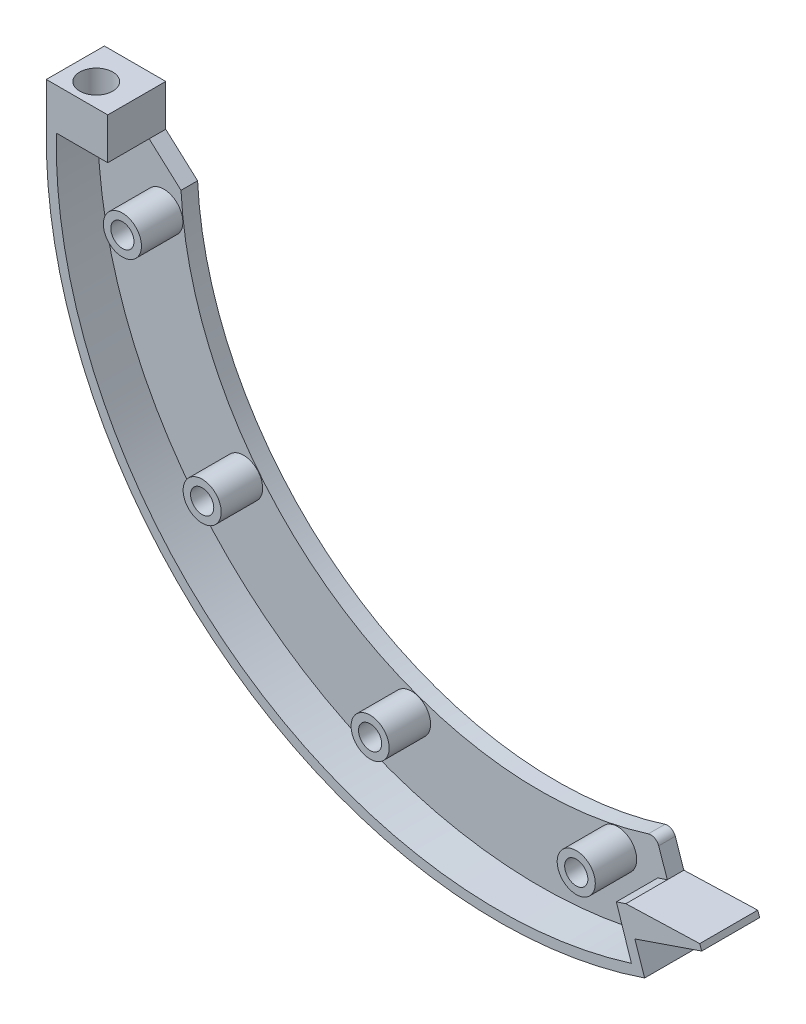
ISO-10303-21;
HEADER;
FILE_DESCRIPTION(('STEP AP214'),'2;1');
FILE_NAME('part.step','',(''),(''),'','','');
FILE_SCHEMA(('AUTOMOTIVE_DESIGN { 1 0 10303 214 1 1 1 1 }'));
ENDSEC;
DATA;
#1=APPLICATION_CONTEXT('core data for automotive mechanical design processes');
#2=APPLICATION_PROTOCOL_DEFINITION('international standard','automotive_design',2000,#1);
#3=PRODUCT_CONTEXT('',#1,'mechanical');
#4=PRODUCT('Part','Part','',(#3));
#5=PRODUCT_RELATED_PRODUCT_CATEGORY('part','',(#4));
#6=PRODUCT_DEFINITION_FORMATION('','',#4);
#7=PRODUCT_DEFINITION_CONTEXT('part definition',#1,'design');
#8=PRODUCT_DEFINITION('design','',#6,#7);
#9=PRODUCT_DEFINITION_SHAPE('','',#8);
#10=(LENGTH_UNIT() NAMED_UNIT(*) SI_UNIT(.MILLI.,.METRE.));
#11=(NAMED_UNIT(*) PLANE_ANGLE_UNIT() SI_UNIT($,.RADIAN.));
#12=(NAMED_UNIT(*) SI_UNIT($,.STERADIAN.) SOLID_ANGLE_UNIT());
#13=UNCERTAINTY_MEASURE_WITH_UNIT(LENGTH_MEASURE(1.E-05),#10,'distance_accuracy_value','');
#14=(GEOMETRIC_REPRESENTATION_CONTEXT(3) GLOBAL_UNCERTAINTY_ASSIGNED_CONTEXT((#13)) GLOBAL_UNIT_ASSIGNED_CONTEXT((#10,
#11,#12)) REPRESENTATION_CONTEXT('',''));
#15=CARTESIAN_POINT('',(0.,0.,0.));
#16=DIRECTION('',(0.,0.,1.));
#17=DIRECTION('',(1.,0.,0.));
#18=AXIS2_PLACEMENT_3D('',#15,#16,#17);
#19=CARTESIAN_POINT('',(14.6736792549798,-134.127250964701,2.));
#20=DIRECTION('',(-0.946107937554951,-0.323851463630345,0.));
#21=DIRECTION('',(0.323851463630345,-0.946107937554951,0.));
#22=AXIS2_PLACEMENT_3D('',#19,#20,#21);
#23=PLANE('',#22);
#24=DIRECTION('',(0.,0.,-1.));
#25=VECTOR('',#24,1.);
#26=CARTESIAN_POINT('',(14.6736792549798,-134.127250964701,2.));
#27=LINE('',#26,#25);
#28=CARTESIAN_POINT('',(14.6736792549798,-134.127250964701,7.));
#29=VERTEX_POINT('',#28);
#30=CARTESIAN_POINT('',(14.6736792549798,-134.127250964701,0.));
#31=VERTEX_POINT('',#30);
#32=EDGE_CURVE('E284',#29,#31,#27,.T.);
#33=ORIENTED_EDGE('',*,*,#32,.F.);
#34=DIRECTION('',(-0.323851463630344,0.946107937554951,0.));
#35=VECTOR('',#34,1.);
#36=CARTESIAN_POINT('',(15.8676694079897,-137.6154042942,7.));
#37=LINE('',#36,#35);
#38=CARTESIAN_POINT('',(15.8676694079897,-137.6154042942,7.));
#39=VERTEX_POINT('',#38);
#40=EDGE_CURVE('E226',#39,#29,#37,.T.);
#41=ORIENTED_EDGE('',*,*,#40,.F.);
#42=DIRECTION('',(0.,0.,-1.));
#43=VECTOR('',#42,1.);
#44=CARTESIAN_POINT('',(15.8676694079896,-137.6154042942,2.));
#45=LINE('',#44,#43);
#46=CARTESIAN_POINT('',(15.8676694079896,-137.6154042942,0.));
#47=VERTEX_POINT('',#46);
#48=EDGE_CURVE('E287',#39,#47,#45,.T.);
#49=ORIENTED_EDGE('',*,*,#48,.T.);
#50=DIRECTION('',(-0.323851463630345,0.946107937554951,0.));
#51=VECTOR('',#50,1.);
#52=CARTESIAN_POINT('',(14.6736792549798,-134.127250964701,0.));
#53=LINE('',#52,#51);
#54=EDGE_CURVE('E275',#47,#31,#53,.T.);
#55=ORIENTED_EDGE('',*,*,#54,.T.);
#56=EDGE_LOOP('',(#33,#41,#49,#55));
#57=FACE_BOUND('',#56,.T.);
#58=ADVANCED_FACE('F34',(#57),#23,.F.);
#59=CARTESIAN_POINT('',(13.5976751917569,-130.983785211468,2.));
#60=DIRECTION('',(0.0319240642782076,-0.999490297161489,0.));
#61=DIRECTION('',(0.999490297161489,0.0319240642782076,0.));
#62=AXIS2_PLACEMENT_3D('',#59,#60,#61);
#63=PLANE('',#62);
#64=DIRECTION('',(-0.999490297161489,-0.0319240642782076,0.));
#65=VECTOR('',#64,1.);
#66=CARTESIAN_POINT('',(13.5976751917569,-130.983785211468,0.));
#67=LINE('',#66,#65);
#68=CARTESIAN_POINT('',(22.5089113422996,-130.699157260125,0.));
#69=VERTEX_POINT('',#68);
#70=CARTESIAN_POINT('',(13.5976751917569,-130.983785211468,0.));
#71=VERTEX_POINT('',#70);
#72=EDGE_CURVE('E252',#69,#71,#67,.T.);
#73=ORIENTED_EDGE('',*,*,#72,.T.);
#74=DIRECTION('',(0.,0.,-1.));
#75=VECTOR('',#74,1.);
#76=CARTESIAN_POINT('',(13.5976751917569,-130.983785211468,2.));
#77=LINE('',#76,#75);
#78=CARTESIAN_POINT('',(13.5976751917569,-130.983785211468,2.));
#79=VERTEX_POINT('',#78);
#80=EDGE_CURVE('E11',#79,#71,#77,.T.);
#81=ORIENTED_EDGE('',*,*,#80,.F.);
#82=DIRECTION('',(0.,0.,-1.));
#83=VECTOR('',#82,1.);
#84=CARTESIAN_POINT('',(13.5976751917569,-130.983785211468,7.));
#85=LINE('',#84,#83);
#86=CARTESIAN_POINT('',(13.5976751917569,-130.983785211468,7.));
#87=VERTEX_POINT('',#86);
#88=EDGE_CURVE('E249',#87,#79,#85,.T.);
#89=ORIENTED_EDGE('',*,*,#88,.F.);
#90=DIRECTION('',(-0.999490297161489,-0.0319240642782076,0.));
#91=VECTOR('',#90,1.);
#92=CARTESIAN_POINT('',(22.5089113422996,-130.699157260125,7.));
#93=LINE('',#92,#91);
#94=CARTESIAN_POINT('',(22.5089113422996,-130.699157260125,7.));
#95=VERTEX_POINT('',#94);
#96=EDGE_CURVE('E196',#95,#87,#93,.T.);
#97=ORIENTED_EDGE('',*,*,#96,.F.);
#98=DIRECTION('',(0.,0.,-1.));
#99=VECTOR('',#98,1.);
#100=CARTESIAN_POINT('',(22.5089113422996,-130.699157260125,2.));
#101=LINE('',#100,#99);
#102=EDGE_CURVE('E261',#95,#69,#101,.T.);
#103=ORIENTED_EDGE('',*,*,#102,.T.);
#104=EDGE_LOOP('',(#73,#81,#89,#97,#103));
#105=FACE_BOUND('',#104,.T.);
#106=ADVANCED_FACE('F36',(#105),#63,.F.);
#107=CARTESIAN_POINT('',(12.560733381261,-127.954436921066,2.));
#108=DIRECTION('',(-0.94610793755495,-0.323851463630347,0.));
#109=DIRECTION('',(0.323851463630347,-0.94610793755495,0.));
#110=AXIS2_PLACEMENT_3D('',#107,#108,#109);
#111=PLANE('',#110);
#112=DIRECTION('',(-0.323851463630347,0.94610793755495,0.));
#113=VECTOR('',#112,1.);
#114=CARTESIAN_POINT('',(12.560733381261,-127.954436921066,0.));
#115=LINE('',#114,#113);
#116=CARTESIAN_POINT('',(12.560733381261,-127.954436921066,0.));
#117=VERTEX_POINT('',#116);
#118=EDGE_CURVE('E264',#71,#117,#115,.T.);
#119=ORIENTED_EDGE('',*,*,#118,.T.);
#120=DIRECTION('',(0.,0.,-1.));
#121=VECTOR('',#120,1.);
#122=CARTESIAN_POINT('',(12.560733381261,-127.954436921066,2.));
#123=LINE('',#122,#121);
#124=CARTESIAN_POINT('',(12.560733381261,-127.954436921066,2.));
#125=VERTEX_POINT('',#124);
#126=EDGE_CURVE('E43',#125,#117,#123,.T.);
#127=ORIENTED_EDGE('',*,*,#126,.F.);
#128=DIRECTION('',(-0.323851463630347,0.94610793755495,0.));
#129=VECTOR('',#128,1.);
#130=CARTESIAN_POINT('',(12.560733381261,-127.954436921066,2.));
#131=LINE('',#130,#129);
#132=EDGE_CURVE('E96',#79,#125,#131,.T.);
#133=ORIENTED_EDGE('',*,*,#132,.F.);
#134=ORIENTED_EDGE('',*,*,#80,.T.);
#135=EDGE_LOOP('',(#119,#127,#133,#134));
#136=FACE_BOUND('',#135,.T.);
#137=ADVANCED_FACE('F411',(#136),#111,.F.);
#138=CARTESIAN_POINT('',(11.614625443706,-128.278288384696,2.));
#139=DIRECTION('',(0.,0.,-1.));
#140=DIRECTION('',(-1.,0.,0.));
#141=AXIS2_PLACEMENT_3D('',#138,#139,#140);
#142=CYLINDRICAL_SURFACE('',#141,1.00000000000001);
#143=CARTESIAN_POINT('',(11.614625443706,-128.278288384696,0.));
#144=DIRECTION('',(0.,0.,1.));
#145=DIRECTION('',(1.,0.,0.));
#146=AXIS2_PLACEMENT_3D('',#143,#144,#145);
#147=CIRCLE('',#146,1.00000000000001);
#148=CARTESIAN_POINT('',(11.3121864035106,-127.32511965516,0.));
#149=VERTEX_POINT('',#148);
#150=EDGE_CURVE('E266',#117,#149,#147,.T.);
#151=ORIENTED_EDGE('',*,*,#150,.T.);
#152=DIRECTION('',(0.,0.,-1.));
#153=VECTOR('',#152,1.);
#154=CARTESIAN_POINT('',(11.3121864035106,-127.32511965516,2.));
#155=LINE('',#154,#153);
#156=CARTESIAN_POINT('',(11.3121864035106,-127.32511965516,2.));
#157=VERTEX_POINT('',#156);
#158=EDGE_CURVE('E298',#157,#149,#155,.T.);
#159=ORIENTED_EDGE('',*,*,#158,.F.);
#160=CARTESIAN_POINT('',(11.614625443706,-128.278288384696,2.));
#161=DIRECTION('',(0.,0.,1.));
#162=DIRECTION('',(1.,0.,0.));
#163=AXIS2_PLACEMENT_3D('',#160,#161,#162);
#164=CIRCLE('',#163,1.00000000000001);
#165=EDGE_CURVE('E254',#125,#157,#164,.T.);
#166=ORIENTED_EDGE('',*,*,#165,.F.);
#167=ORIENTED_EDGE('',*,*,#126,.T.);
#168=EDGE_LOOP('',(#151,#159,#166,#167));
#169=FACE_BOUND('',#168,.T.);
#170=ADVANCED_FACE('F305',(#169),#142,.T.);
#171=CARTESIAN_POINT('',(-1.8002134656574,-86.,2.));
#172=DIRECTION('',(0.,0.,-1.));
#173=DIRECTION('',(-1.,0.,0.));
#174=AXIS2_PLACEMENT_3D('',#171,#172,#173);
#175=CYLINDRICAL_SURFACE('',#174,43.3555134307302);
#176=CARTESIAN_POINT('',(-1.8002134656574,-86.,0.));
#177=DIRECTION('',(0.,0.,-1.));
#178=DIRECTION('',(1.,0.,0.));
#179=AXIS2_PLACEMENT_3D('',#176,#177,#178);
#180=CIRCLE('',#179,43.3555134307302);
#181=CARTESIAN_POINT('',(-45.0967686238364,-88.2602779202986,0.));
#182=VERTEX_POINT('',#181);
#183=EDGE_CURVE('E268',#149,#182,#180,.T.);
#184=ORIENTED_EDGE('',*,*,#183,.T.);
#185=DIRECTION('',(0.,0.,-1.));
#186=VECTOR('',#185,1.);
#187=CARTESIAN_POINT('',(-45.0967686238364,-88.2602779202986,2.));
#188=LINE('',#187,#186);
#189=CARTESIAN_POINT('',(-45.0967686238364,-88.2602779202986,2.));
#190=VERTEX_POINT('',#189);
#191=EDGE_CURVE('E295',#190,#182,#188,.T.);
#192=ORIENTED_EDGE('',*,*,#191,.F.);
#193=CARTESIAN_POINT('',(-1.8002134656574,-86.,2.));
#194=DIRECTION('',(0.,0.,-1.));
#195=DIRECTION('',(1.,0.,0.));
#196=AXIS2_PLACEMENT_3D('',#193,#194,#195);
#197=CIRCLE('',#196,43.3555134307302);
#198=EDGE_CURVE('E58',#157,#190,#197,.T.);
#199=ORIENTED_EDGE('',*,*,#198,.F.);
#200=ORIENTED_EDGE('',*,*,#158,.T.);
#201=EDGE_LOOP('',(#184,#192,#199,#200));
#202=FACE_BOUND('',#201,.T.);
#203=ADVANCED_FACE('F315',(#202),#175,.F.);
#204=CARTESIAN_POINT('',(-48.9404557954946,-84.8,2.));
#205=DIRECTION('',(-0.669067221918904,-0.743201892189276,0.));
#206=DIRECTION('',(0.743201892189276,-0.669067221918904,0.));
#207=AXIS2_PLACEMENT_3D('',#204,#205,#206);
#208=PLANE('',#207);
#209=DIRECTION('',(-0.743201892189276,0.669067221918904,0.));
#210=VECTOR('',#209,1.);
#211=CARTESIAN_POINT('',(-48.9404557954946,-84.8,0.));
#212=LINE('',#211,#210);
#213=CARTESIAN_POINT('',(-48.9404557954946,-84.8,0.));
#214=VERTEX_POINT('',#213);
#215=EDGE_CURVE('E270',#182,#214,#212,.T.);
#216=ORIENTED_EDGE('',*,*,#215,.T.);
#217=DIRECTION('',(0.,0.,-1.));
#218=VECTOR('',#217,1.);
#219=CARTESIAN_POINT('',(-48.9404557954946,-84.8,2.));
#220=LINE('',#219,#218);
#221=CARTESIAN_POINT('',(-48.9404557954946,-84.8,2.));
#222=VERTEX_POINT('',#221);
#223=EDGE_CURVE('E293',#222,#214,#220,.T.);
#224=ORIENTED_EDGE('',*,*,#223,.F.);
#225=DIRECTION('',(-0.743201892189276,0.669067221918904,0.));
#226=VECTOR('',#225,1.);
#227=CARTESIAN_POINT('',(-48.9404557954946,-84.8,2.));
#228=LINE('',#227,#226);
#229=EDGE_CURVE('E257',#190,#222,#228,.T.);
#230=ORIENTED_EDGE('',*,*,#229,.F.);
#231=ORIENTED_EDGE('',*,*,#191,.T.);
#232=EDGE_LOOP('',(#216,#224,#230,#231));
#233=FACE_BOUND('',#232,.T.);
#234=ADVANCED_FACE('F318',(#233),#208,.F.);
#235=CARTESIAN_POINT('',(-1.8002134656574,-86.,2.));
#236=DIRECTION('',(0.,0.,-1.));
#237=DIRECTION('',(-1.,0.,0.));
#238=AXIS2_PLACEMENT_3D('',#235,#236,#237);
#239=CYLINDRICAL_SURFACE('',#238,54.5555134307302);
#240=CARTESIAN_POINT('',(-1.8002134656574,-86.,0.));
#241=DIRECTION('',(0.,0.,1.));
#242=DIRECTION('',(1.,0.,0.));
#243=AXIS2_PLACEMENT_3D('',#240,#241,#242);
#244=CIRCLE('',#243,54.5555134307302);
#245=CARTESIAN_POINT('',(-56.342527733486,-84.8,0.));
#246=VERTEX_POINT('',#245);
#247=EDGE_CURVE('E273',#246,#47,#244,.T.);
#248=ORIENTED_EDGE('',*,*,#247,.T.);
#249=ORIENTED_EDGE('',*,*,#48,.F.);
#250=CARTESIAN_POINT('',(-1.8002134656574,-86.,7.));
#251=DIRECTION('',(0.,0.,1.));
#252=DIRECTION('',(1.,0.,0.));
#253=AXIS2_PLACEMENT_3D('',#250,#251,#252);
#254=CIRCLE('',#253,54.5555134307302);
#255=CARTESIAN_POINT('',(-56.342527733486,-84.8,7.));
#256=VERTEX_POINT('',#255);
#257=EDGE_CURVE('E224',#256,#39,#254,.T.);
#258=ORIENTED_EDGE('',*,*,#257,.F.);
#259=DIRECTION('',(0.,0.,-1.));
#260=VECTOR('',#259,1.);
#261=CARTESIAN_POINT('',(-56.342527733486,-84.8,2.));
#262=LINE('',#261,#260);
#263=EDGE_CURVE('E290',#256,#246,#262,.T.);
#264=ORIENTED_EDGE('',*,*,#263,.T.);
#265=EDGE_LOOP('',(#248,#249,#258,#264));
#266=FACE_BOUND('',#265,.T.);
#267=ADVANCED_FACE('F352',(#266),#239,.T.);
#268=CARTESIAN_POINT('',(16.8879105550717,-133.369322594283,2.));
#269=DIRECTION('',(-0.323851463630348,0.94610793755495,0.));
#270=DIRECTION('',(-0.94610793755495,-0.323851463630348,0.));
#271=AXIS2_PLACEMENT_3D('',#268,#269,#270);
#272=PLANE('',#271);
#273=DIRECTION('',(0.94610793755495,0.323851463630348,0.));
#274=VECTOR('',#273,1.);
#275=CARTESIAN_POINT('',(16.8879105550717,-133.369322594283,0.));
#276=LINE('',#275,#274);
#277=CARTESIAN_POINT('',(22.7494643441701,-131.362920683468,0.));
#278=VERTEX_POINT('',#277);
#279=EDGE_CURVE('E278',#31,#278,#276,.T.);
#280=ORIENTED_EDGE('',*,*,#279,.T.);
#281=DIRECTION('',(0.,0.,-1.));
#282=VECTOR('',#281,1.);
#283=CARTESIAN_POINT('',(22.7494643441701,-131.362920683468,2.));
#284=LINE('',#283,#282);
#285=CARTESIAN_POINT('',(22.7494643441701,-131.362920683468,7.));
#286=VERTEX_POINT('',#285);
#287=EDGE_CURVE('E282',#286,#278,#284,.T.);
#288=ORIENTED_EDGE('',*,*,#287,.F.);
#289=DIRECTION('',(0.94610793755495,0.323851463630347,0.));
#290=VECTOR('',#289,1.);
#291=CARTESIAN_POINT('',(14.6736792549798,-134.127250964701,7.));
#292=LINE('',#291,#290);
#293=EDGE_CURVE('E185',#29,#286,#292,.T.);
#294=ORIENTED_EDGE('',*,*,#293,.F.);
#295=ORIENTED_EDGE('',*,*,#32,.T.);
#296=EDGE_LOOP('',(#280,#288,#294,#295));
#297=FACE_BOUND('',#296,.T.);
#298=ADVANCED_FACE('F347',(#297),#272,.F.);
#299=CARTESIAN_POINT('',(22.5089113422996,-130.699157260125,2.));
#300=DIRECTION('',(-0.940163853307504,-0.340722656913194,0.));
#301=DIRECTION('',(0.340722656913194,-0.940163853307504,0.));
#302=AXIS2_PLACEMENT_3D('',#299,#300,#301);
#303=PLANE('',#302);
#304=DIRECTION('',(-0.340722656913194,0.940163853307504,0.));
#305=VECTOR('',#304,1.);
#306=CARTESIAN_POINT('',(22.5089113422996,-130.699157260125,0.));
#307=LINE('',#306,#305);
#308=EDGE_CURVE('E91',#278,#69,#307,.T.);
#309=ORIENTED_EDGE('',*,*,#308,.T.);
#310=ORIENTED_EDGE('',*,*,#102,.F.);
#311=DIRECTION('',(-0.340722656913194,0.940163853307504,0.));
#312=VECTOR('',#311,1.);
#313=CARTESIAN_POINT('',(22.7494643441701,-131.362920683468,7.));
#314=LINE('',#313,#312);
#315=EDGE_CURVE('E188',#286,#95,#314,.T.);
#316=ORIENTED_EDGE('',*,*,#315,.F.);
#317=ORIENTED_EDGE('',*,*,#287,.T.);
#318=EDGE_LOOP('',(#309,#310,#316,#317));
#319=FACE_BOUND('',#318,.T.);
#320=ADVANCED_FACE('F341',(#319),#303,.F.);
#321=CARTESIAN_POINT('',(-1.8002134656574,-86.,2.));
#322=DIRECTION('',(0.,0.,1.));
#323=DIRECTION('',(1.,0.,0.));
#324=AXIS2_PLACEMENT_3D('',#321,#322,#323);
#325=PLANE('',#324);
#326=CARTESIAN_POINT('',(-47.1727402853458,-91.4738290971626,2.));
#327=DIRECTION('',(0.,0.,1.));
#328=DIRECTION('',(1.,0.,0.));
#329=AXIS2_PLACEMENT_3D('',#326,#327,#328);
#330=CIRCLE('',#329,2.29999999999999);
#331=CARTESIAN_POINT('',(-44.8727402853458,-91.4738290971626,2.));
#332=VERTEX_POINT('',#331);
#333=EDGE_CURVE('E199',#332,#332,#330,.T.);
#334=ORIENTED_EDGE('',*,*,#333,.F.);
#335=EDGE_LOOP('',(#334));
#336=FACE_BOUND('',#335,.T.);
#337=CARTESIAN_POINT('',(-37.5438954317248,-114.478381177604,2.));
#338=DIRECTION('',(0.,0.,1.));
#339=DIRECTION('',(1.,0.,0.));
#340=AXIS2_PLACEMENT_3D('',#337,#338,#339);
#341=CIRCLE('',#340,2.30000000000001);
#342=CARTESIAN_POINT('',(-35.2438954317248,-114.478381177604,2.));
#343=VERTEX_POINT('',#342);
#344=EDGE_CURVE('E203',#343,#343,#341,.T.);
#345=ORIENTED_EDGE('',*,*,#344,.F.);
#346=EDGE_LOOP('',(#345));
#347=FACE_BOUND('',#346,.T.);
#348=CARTESIAN_POINT('',(-17.2717739571804,-129.003020951387,2.));
#349=DIRECTION('',(0.,0.,1.));
#350=DIRECTION('',(1.,0.,0.));
#351=AXIS2_PLACEMENT_3D('',#348,#349,#350);
#352=CIRCLE('',#351,2.3);
#353=CARTESIAN_POINT('',(-14.9717739571804,-129.003020951387,2.));
#354=VERTEX_POINT('',#353);
#355=EDGE_CURVE('E209',#354,#354,#352,.T.);
#356=ORIENTED_EDGE('',*,*,#355,.F.);
#357=EDGE_LOOP('',(#356));
#358=FACE_BOUND('',#357,.T.);
#359=CARTESIAN_POINT('',(7.60726233450451,-130.722795016162,2.));
#360=DIRECTION('',(0.,0.,1.));
#361=DIRECTION('',(1.,0.,0.));
#362=AXIS2_PLACEMENT_3D('',#359,#360,#361);
#363=CIRCLE('',#362,2.3);
#364=CARTESIAN_POINT('',(9.90726233450451,-130.722795016162,2.));
#365=VERTEX_POINT('',#364);
#366=EDGE_CURVE('E215',#365,#365,#363,.T.);
#367=ORIENTED_EDGE('',*,*,#366,.F.);
#368=EDGE_LOOP('',(#367));
#369=FACE_BOUND('',#368,.T.);
#370=CARTESIAN_POINT('',(-1.8002134656574,-86.,2.));
#371=DIRECTION('',(0.,0.,-1.));
#372=DIRECTION('',(-1.,0.,0.));
#373=AXIS2_PLACEMENT_3D('',#370,#371,#372);
#374=CIRCLE('',#373,53.3555134307302);
#375=CARTESIAN_POINT('',(14.2618263258736,-136.880464730504,2.));
#376=VERTEX_POINT('',#375);
#377=CARTESIAN_POINT('',(-55.1422308014953,-84.8,2.));
#378=VERTEX_POINT('',#377);
#379=EDGE_CURVE('E50',#376,#378,#374,.T.);
#380=ORIENTED_EDGE('',*,*,#379,.F.);
#381=DIRECTION('',(0.311856299867698,-0.950129279747145,0.));
#382=VECTOR('',#381,1.);
#383=CARTESIAN_POINT('',(14.2618263258736,-136.880464730504,2.));
#384=LINE('',#383,#382);
#385=CARTESIAN_POINT('',(12.4500261796725,-131.360472449809,2.));
#386=VERTEX_POINT('',#385);
#387=EDGE_CURVE('E239',#386,#376,#384,.T.);
#388=ORIENTED_EDGE('',*,*,#387,.F.);
#389=DIRECTION('',(-0.950129279747144,-0.311856299867699,0.));
#390=VECTOR('',#389,1.);
#391=CARTESIAN_POINT('',(13.5976751917569,-130.983785211468,2.));
#392=LINE('',#391,#390);
#393=EDGE_CURVE('E221',#79,#386,#392,.T.);
#394=ORIENTED_EDGE('',*,*,#393,.F.);
#395=ORIENTED_EDGE('',*,*,#132,.T.);
#396=ORIENTED_EDGE('',*,*,#165,.T.);
#397=ORIENTED_EDGE('',*,*,#198,.T.);
#398=ORIENTED_EDGE('',*,*,#229,.T.);
#399=DIRECTION('',(-1.,0.,0.));
#400=VECTOR('',#399,1.);
#401=CARTESIAN_POINT('',(-48.9404557954946,-84.8,2.));
#402=LINE('',#401,#400);
#403=EDGE_CURVE('E259',#222,#378,#402,.T.);
#404=ORIENTED_EDGE('',*,*,#403,.T.);
#405=EDGE_LOOP('',(#380,#388,#394,#395,#396,#397,#398,#404));
#406=FACE_BOUND('',#405,.T.);
#407=ADVANCED_FACE('F320',(#336,#347,#358,#369,#406),#325,.T.);
#408=CARTESIAN_POINT('',(-1.8002134656574,-86.,0.));
#409=DIRECTION('',(0.,0.,1.));
#410=DIRECTION('',(1.,0.,0.));
#411=AXIS2_PLACEMENT_3D('',#408,#409,#410);
#412=PLANE('',#411);
#413=ORIENTED_EDGE('',*,*,#72,.F.);
#414=ORIENTED_EDGE('',*,*,#308,.F.);
#415=ORIENTED_EDGE('',*,*,#279,.F.);
#416=ORIENTED_EDGE('',*,*,#54,.F.);
#417=ORIENTED_EDGE('',*,*,#247,.F.);
#418=DIRECTION('',(0.,-1.,0.));
#419=VECTOR('',#418,1.);
#420=CARTESIAN_POINT('',(-56.342527733486,-79.8,0.));
#421=LINE('',#420,#419);
#422=CARTESIAN_POINT('',(-56.342527733486,-79.8,0.));
#423=VERTEX_POINT('',#422);
#424=EDGE_CURVE('E353',#423,#246,#421,.T.);
#425=ORIENTED_EDGE('',*,*,#424,.F.);
#426=DIRECTION('',(-1.,0.,0.));
#427=VECTOR('',#426,1.);
#428=CARTESIAN_POINT('',(-56.342527733486,-79.8,0.));
#429=LINE('',#428,#427);
#430=CARTESIAN_POINT('',(-48.9404557954946,-79.8,0.));
#431=VERTEX_POINT('',#430);
#432=EDGE_CURVE('E177',#431,#423,#429,.T.);
#433=ORIENTED_EDGE('',*,*,#432,.F.);
#434=DIRECTION('',(0.,-1.,0.));
#435=VECTOR('',#434,1.);
#436=CARTESIAN_POINT('',(-48.9404557954946,-79.8,0.));
#437=LINE('',#436,#435);
#438=EDGE_CURVE('E190',#431,#214,#437,.T.);
#439=ORIENTED_EDGE('',*,*,#438,.T.);
#440=ORIENTED_EDGE('',*,*,#215,.F.);
#441=ORIENTED_EDGE('',*,*,#183,.F.);
#442=ORIENTED_EDGE('',*,*,#150,.F.);
#443=ORIENTED_EDGE('',*,*,#118,.F.);
#444=EDGE_LOOP('',(#413,#414,#415,#416,#417,#425,#433,#439,#440,#441,#442,#443));
#445=FACE_BOUND('',#444,.T.);
#446=ADVANCED_FACE('F311',(#445),#412,.F.);
#447=CARTESIAN_POINT('',(13.5976751917569,-130.983785211468,7.));
#448=DIRECTION('',(0.311856299867699,-0.950129279747144,0.));
#449=DIRECTION('',(0.950129279747145,0.311856299867699,0.));
#450=AXIS2_PLACEMENT_3D('',#447,#448,#449);
#451=PLANE('',#450);
#452=ORIENTED_EDGE('',*,*,#393,.T.);
#453=DIRECTION('',(0.,0.,-1.));
#454=VECTOR('',#453,1.);
#455=CARTESIAN_POINT('',(12.4500261796725,-131.360472449809,7.));
#456=LINE('',#455,#454);
#457=CARTESIAN_POINT('',(12.4500261796725,-131.360472449809,7.));
#458=VERTEX_POINT('',#457);
#459=EDGE_CURVE('E246',#458,#386,#456,.T.);
#460=ORIENTED_EDGE('',*,*,#459,.F.);
#461=DIRECTION('',(-0.950129279747144,-0.311856299867699,0.));
#462=VECTOR('',#461,1.);
#463=CARTESIAN_POINT('',(13.5976751917569,-130.983785211468,7.));
#464=LINE('',#463,#462);
#465=EDGE_CURVE('E229',#87,#458,#464,.T.);
#466=ORIENTED_EDGE('',*,*,#465,.F.);
#467=ORIENTED_EDGE('',*,*,#88,.T.);
#468=EDGE_LOOP('',(#452,#460,#466,#467));
#469=FACE_BOUND('',#468,.T.);
#470=ADVANCED_FACE('F334',(#469),#451,.F.);
#471=CARTESIAN_POINT('',(14.2618263258736,-136.880464730504,7.));
#472=DIRECTION('',(0.950129279747145,0.311856299867698,0.));
#473=DIRECTION('',(-0.311856299867698,0.950129279747145,0.));
#474=AXIS2_PLACEMENT_3D('',#471,#472,#473);
#475=PLANE('',#474);
#476=ORIENTED_EDGE('',*,*,#387,.T.);
#477=DIRECTION('',(0.,0.,-1.));
#478=VECTOR('',#477,1.);
#479=CARTESIAN_POINT('',(14.2618263258736,-136.880464730504,7.));
#480=LINE('',#479,#478);
#481=CARTESIAN_POINT('',(14.2618263258736,-136.880464730504,7.));
#482=VERTEX_POINT('',#481);
#483=EDGE_CURVE('E243',#482,#376,#480,.T.);
#484=ORIENTED_EDGE('',*,*,#483,.F.);
#485=DIRECTION('',(0.311856299867698,-0.950129279747145,0.));
#486=VECTOR('',#485,1.);
#487=CARTESIAN_POINT('',(14.2618263258736,-136.880464730504,7.));
#488=LINE('',#487,#486);
#489=EDGE_CURVE('E231',#458,#482,#488,.T.);
#490=ORIENTED_EDGE('',*,*,#489,.F.);
#491=ORIENTED_EDGE('',*,*,#459,.T.);
#492=EDGE_LOOP('',(#476,#484,#490,#491));
#493=FACE_BOUND('',#492,.T.);
#494=ADVANCED_FACE('F331',(#493),#475,.F.);
#495=CARTESIAN_POINT('',(-1.8002134656574,-86.,7.));
#496=DIRECTION('',(0.,0.,-1.));
#497=DIRECTION('',(-1.,0.,0.));
#498=AXIS2_PLACEMENT_3D('',#495,#496,#497);
#499=CYLINDRICAL_SURFACE('',#498,53.3555134307302);
#500=ORIENTED_EDGE('',*,*,#379,.T.);
#501=DIRECTION('',(0.,0.,-1.));
#502=VECTOR('',#501,1.);
#503=CARTESIAN_POINT('',(-55.1422308014953,-84.8,7.));
#504=LINE('',#503,#502);
#505=CARTESIAN_POINT('',(-55.1422308014953,-84.8,7.));
#506=VERTEX_POINT('',#505);
#507=EDGE_CURVE('E236',#506,#378,#504,.T.);
#508=ORIENTED_EDGE('',*,*,#507,.F.);
#509=CARTESIAN_POINT('',(-1.8002134656574,-86.,7.));
#510=DIRECTION('',(0.,0.,-1.));
#511=DIRECTION('',(1.,0.,0.));
#512=AXIS2_PLACEMENT_3D('',#509,#510,#511);
#513=CIRCLE('',#512,53.3555134307302);
#514=EDGE_CURVE('E233',#482,#506,#513,.T.);
#515=ORIENTED_EDGE('',*,*,#514,.F.);
#516=ORIENTED_EDGE('',*,*,#483,.T.);
#517=EDGE_LOOP('',(#500,#508,#515,#516));
#518=FACE_BOUND('',#517,.T.);
#519=ADVANCED_FACE('F326',(#518),#499,.F.);
#520=CARTESIAN_POINT('',(-1.8002134656574,-86.,7.));
#521=DIRECTION('',(0.,0.,1.));
#522=DIRECTION('',(1.,0.,0.));
#523=AXIS2_PLACEMENT_3D('',#520,#521,#522);
#524=PLANE('',#523);
#525=ORIENTED_EDGE('',*,*,#257,.T.);
#526=ORIENTED_EDGE('',*,*,#40,.T.);
#527=ORIENTED_EDGE('',*,*,#293,.T.);
#528=ORIENTED_EDGE('',*,*,#315,.T.);
#529=ORIENTED_EDGE('',*,*,#96,.T.);
#530=ORIENTED_EDGE('',*,*,#465,.T.);
#531=ORIENTED_EDGE('',*,*,#489,.T.);
#532=ORIENTED_EDGE('',*,*,#514,.T.);
#533=DIRECTION('',(1.,0.,0.));
#534=VECTOR('',#533,1.);
#535=CARTESIAN_POINT('',(-56.3557268963876,-84.8,7.));
#536=LINE('',#535,#534);
#537=CARTESIAN_POINT('',(-48.9404557954946,-84.8,7.));
#538=VERTEX_POINT('',#537);
#539=EDGE_CURVE('E359',#506,#538,#536,.T.);
#540=ORIENTED_EDGE('',*,*,#539,.T.);
#541=DIRECTION('',(0.,-1.,0.));
#542=VECTOR('',#541,1.);
#543=CARTESIAN_POINT('',(-48.9404557954946,-79.8,7.));
#544=LINE('',#543,#542);
#545=CARTESIAN_POINT('',(-48.9404557954946,-79.8,7.));
#546=VERTEX_POINT('',#545);
#547=EDGE_CURVE('E168',#546,#538,#544,.T.);
#548=ORIENTED_EDGE('',*,*,#547,.F.);
#549=DIRECTION('',(1.,0.,0.));
#550=VECTOR('',#549,1.);
#551=CARTESIAN_POINT('',(-56.3557268963876,-79.8,7.));
#552=LINE('',#551,#550);
#553=CARTESIAN_POINT('',(-56.3557268963876,-79.8,7.));
#554=VERTEX_POINT('',#553);
#555=EDGE_CURVE('E160',#554,#546,#552,.T.);
#556=ORIENTED_EDGE('',*,*,#555,.F.);
#557=DIRECTION('',(0.,-1.,0.));
#558=VECTOR('',#557,1.);
#559=CARTESIAN_POINT('',(-56.3557268963876,-79.8,7.));
#560=LINE('',#559,#558);
#561=CARTESIAN_POINT('',(-56.3557268963876,-84.8,7.));
#562=VERTEX_POINT('',#561);
#563=EDGE_CURVE('E165',#554,#562,#560,.T.);
#564=ORIENTED_EDGE('',*,*,#563,.T.);
#565=EDGE_CURVE('E349',#562,#256,#536,.T.);
#566=ORIENTED_EDGE('',*,*,#565,.T.);
#567=EDGE_LOOP('',(#525,#526,#527,#528,#529,#530,#531,#532,#540,#548,#556,#564,#566));
#568=FACE_BOUND('',#567,.T.);
#569=ADVANCED_FACE('F163',(#568),#524,.T.);
#570=CARTESIAN_POINT('',(7.60726233450451,-130.722795016162,7.));
#571=DIRECTION('',(0.,0.,-1.));
#572=DIRECTION('',(-1.,0.,0.));
#573=AXIS2_PLACEMENT_3D('',#570,#571,#572);
#574=CYLINDRICAL_SURFACE('',#573,2.3);
#575=CARTESIAN_POINT('',(7.60726233450451,-130.722795016162,7.));
#576=DIRECTION('',(0.,0.,1.));
#577=DIRECTION('',(1.,0.,0.));
#578=AXIS2_PLACEMENT_3D('',#575,#576,#577);
#579=CIRCLE('',#578,2.3);
#580=CARTESIAN_POINT('',(9.90726233450451,-130.722795016162,7.));
#581=VERTEX_POINT('',#580);
#582=EDGE_CURVE('E218',#581,#581,#579,.T.);
#583=ORIENTED_EDGE('',*,*,#582,.F.);
#584=EDGE_LOOP('',(#583));
#585=FACE_BOUND('',#584,.T.);
#586=ORIENTED_EDGE('',*,*,#366,.T.);
#587=EDGE_LOOP('',(#586));
#588=FACE_BOUND('',#587,.T.);
#589=ADVANCED_FACE('F492',(#585,#588),#574,.T.);
#590=CARTESIAN_POINT('',(7.60726233450451,-130.722795016162,7.));
#591=DIRECTION('',(0.,0.,1.));
#592=DIRECTION('',(1.,0.,0.));
#593=AXIS2_PLACEMENT_3D('',#590,#591,#592);
#594=PLANE('',#593);
#595=CARTESIAN_POINT('',(7.60726233450451,-130.722795016162,7.));
#596=DIRECTION('',(0.,0.,1.));
#597=DIRECTION('',(1.,0.,0.));
#598=AXIS2_PLACEMENT_3D('',#595,#596,#597);
#599=CIRCLE('',#598,1.4);
#600=CARTESIAN_POINT('',(9.00726233450451,-130.722795016162,7.));
#601=VERTEX_POINT('',#600);
#602=EDGE_CURVE('E363',#601,#601,#599,.T.);
#603=ORIENTED_EDGE('',*,*,#602,.F.);
#604=EDGE_LOOP('',(#603));
#605=FACE_BOUND('',#604,.T.);
#606=ORIENTED_EDGE('',*,*,#582,.T.);
#607=EDGE_LOOP('',(#606));
#608=FACE_BOUND('',#607,.T.);
#609=ADVANCED_FACE('F499',(#605,#608),#594,.T.);
#610=CARTESIAN_POINT('',(-17.2717739571804,-129.003020951387,7.));
#611=DIRECTION('',(0.,0.,-1.));
#612=DIRECTION('',(-1.,0.,0.));
#613=AXIS2_PLACEMENT_3D('',#610,#611,#612);
#614=CYLINDRICAL_SURFACE('',#613,2.3);
#615=CARTESIAN_POINT('',(-17.2717739571804,-129.003020951387,7.));
#616=DIRECTION('',(0.,0.,1.));
#617=DIRECTION('',(1.,0.,0.));
#618=AXIS2_PLACEMENT_3D('',#615,#616,#617);
#619=CIRCLE('',#618,2.3);
#620=CARTESIAN_POINT('',(-14.9717739571804,-129.003020951387,7.));
#621=VERTEX_POINT('',#620);
#622=EDGE_CURVE('E212',#621,#621,#619,.T.);
#623=ORIENTED_EDGE('',*,*,#622,.F.);
#624=EDGE_LOOP('',(#623));
#625=FACE_BOUND('',#624,.T.);
#626=ORIENTED_EDGE('',*,*,#355,.T.);
#627=EDGE_LOOP('',(#626));
#628=FACE_BOUND('',#627,.T.);
#629=ADVANCED_FACE('F508',(#625,#628),#614,.T.);
#630=CARTESIAN_POINT('',(-17.2717739571804,-129.003020951387,7.));
#631=DIRECTION('',(0.,0.,1.));
#632=DIRECTION('',(1.,0.,0.));
#633=AXIS2_PLACEMENT_3D('',#630,#631,#632);
#634=PLANE('',#633);
#635=CARTESIAN_POINT('',(-17.2717739571804,-129.003020951387,7.));
#636=DIRECTION('',(0.,0.,1.));
#637=DIRECTION('',(1.,0.,0.));
#638=AXIS2_PLACEMENT_3D('',#635,#636,#637);
#639=CIRCLE('',#638,1.4);
#640=CARTESIAN_POINT('',(-15.8717739571804,-129.003020951387,7.));
#641=VERTEX_POINT('',#640);
#642=EDGE_CURVE('E369',#641,#641,#639,.T.);
#643=ORIENTED_EDGE('',*,*,#642,.F.);
#644=EDGE_LOOP('',(#643));
#645=FACE_BOUND('',#644,.T.);
#646=ORIENTED_EDGE('',*,*,#622,.T.);
#647=EDGE_LOOP('',(#646));
#648=FACE_BOUND('',#647,.T.);
#649=ADVANCED_FACE('F517',(#645,#648),#634,.T.);
#650=CARTESIAN_POINT('',(-37.5438954317248,-114.478381177604,7.));
#651=DIRECTION('',(0.,0.,-1.));
#652=DIRECTION('',(-1.,0.,0.));
#653=AXIS2_PLACEMENT_3D('',#650,#651,#652);
#654=CYLINDRICAL_SURFACE('',#653,2.30000000000001);
#655=CARTESIAN_POINT('',(-37.5438954317248,-114.478381177604,7.));
#656=DIRECTION('',(0.,0.,1.));
#657=DIRECTION('',(1.,0.,0.));
#658=AXIS2_PLACEMENT_3D('',#655,#656,#657);
#659=CIRCLE('',#658,2.30000000000001);
#660=CARTESIAN_POINT('',(-35.2438954317248,-114.478381177604,7.));
#661=VERTEX_POINT('',#660);
#662=EDGE_CURVE('E206',#661,#661,#659,.T.);
#663=ORIENTED_EDGE('',*,*,#662,.F.);
#664=EDGE_LOOP('',(#663));
#665=FACE_BOUND('',#664,.T.);
#666=ORIENTED_EDGE('',*,*,#344,.T.);
#667=EDGE_LOOP('',(#666));
#668=FACE_BOUND('',#667,.T.);
#669=ADVANCED_FACE('F525',(#665,#668),#654,.T.);
#670=CARTESIAN_POINT('',(-37.5438954317248,-114.478381177604,7.));
#671=DIRECTION('',(0.,0.,1.));
#672=DIRECTION('',(1.,0.,0.));
#673=AXIS2_PLACEMENT_3D('',#670,#671,#672);
#674=PLANE('',#673);
#675=CARTESIAN_POINT('',(-37.5438954317248,-114.478381177604,7.));
#676=DIRECTION('',(0.,0.,1.));
#677=DIRECTION('',(1.,0.,0.));
#678=AXIS2_PLACEMENT_3D('',#675,#676,#677);
#679=CIRCLE('',#678,1.4);
#680=CARTESIAN_POINT('',(-36.1438954317248,-114.478381177604,7.));
#681=VERTEX_POINT('',#680);
#682=EDGE_CURVE('E375',#681,#681,#679,.T.);
#683=ORIENTED_EDGE('',*,*,#682,.F.);
#684=EDGE_LOOP('',(#683));
#685=FACE_BOUND('',#684,.T.);
#686=ORIENTED_EDGE('',*,*,#662,.T.);
#687=EDGE_LOOP('',(#686));
#688=FACE_BOUND('',#687,.T.);
#689=ADVANCED_FACE('F533',(#685,#688),#674,.T.);
#690=CARTESIAN_POINT('',(-47.1727402853458,-91.4738290971626,7.));
#691=DIRECTION('',(0.,0.,-1.));
#692=DIRECTION('',(-1.,0.,0.));
#693=AXIS2_PLACEMENT_3D('',#690,#691,#692);
#694=CYLINDRICAL_SURFACE('',#693,2.29999999999999);
#695=CARTESIAN_POINT('',(-47.1727402853458,-91.4738290971626,7.));
#696=DIRECTION('',(0.,0.,1.));
#697=DIRECTION('',(1.,0.,0.));
#698=AXIS2_PLACEMENT_3D('',#695,#696,#697);
#699=CIRCLE('',#698,2.29999999999999);
#700=CARTESIAN_POINT('',(-44.8727402853458,-91.4738290971626,7.));
#701=VERTEX_POINT('',#700);
#702=EDGE_CURVE('E200',#701,#701,#699,.T.);
#703=ORIENTED_EDGE('',*,*,#702,.F.);
#704=EDGE_LOOP('',(#703));
#705=FACE_BOUND('',#704,.T.);
#706=ORIENTED_EDGE('',*,*,#333,.T.);
#707=EDGE_LOOP('',(#706));
#708=FACE_BOUND('',#707,.T.);
#709=ADVANCED_FACE('F540',(#705,#708),#694,.T.);
#710=CARTESIAN_POINT('',(-47.1727402853458,-91.4738290971626,7.));
#711=DIRECTION('',(0.,0.,1.));
#712=DIRECTION('',(1.,0.,0.));
#713=AXIS2_PLACEMENT_3D('',#710,#711,#712);
#714=PLANE('',#713);
#715=CARTESIAN_POINT('',(-47.1727402853458,-91.4738290971626,7.));
#716=DIRECTION('',(0.,0.,1.));
#717=DIRECTION('',(1.,0.,0.));
#718=AXIS2_PLACEMENT_3D('',#715,#716,#717);
#719=CIRCLE('',#718,1.4);
#720=CARTESIAN_POINT('',(-45.7727402853458,-91.4738290971626,7.));
#721=VERTEX_POINT('',#720);
#722=EDGE_CURVE('E381',#721,#721,#719,.T.);
#723=ORIENTED_EDGE('',*,*,#722,.F.);
#724=EDGE_LOOP('',(#723));
#725=FACE_BOUND('',#724,.T.);
#726=ORIENTED_EDGE('',*,*,#702,.T.);
#727=EDGE_LOOP('',(#726));
#728=FACE_BOUND('',#727,.T.);
#729=ADVANCED_FACE('F548',(#725,#728),#714,.T.);
#730=CARTESIAN_POINT('',(0.,-84.8,0.));
#731=DIRECTION('',(0.,1.,0.));
#732=DIRECTION('',(0.,0.,1.));
#733=AXIS2_PLACEMENT_3D('',#730,#731,#732);
#734=PLANE('',#733);
#735=DIRECTION('',(-0.00188559134814937,0.,0.999998222271054));
#736=VECTOR('',#735,1.);
#737=CARTESIAN_POINT('',(-56.342527733486,-84.8,0.));
#738=LINE('',#737,#736);
#739=EDGE_CURVE('E184',#246,#562,#738,.T.);
#740=ORIENTED_EDGE('',*,*,#739,.F.);
#741=ORIENTED_EDGE('',*,*,#263,.F.);
#742=ORIENTED_EDGE('',*,*,#565,.F.);
#743=EDGE_LOOP('',(#740,#741,#742));
#744=FACE_BOUND('',#743,.T.);
#745=ADVANCED_FACE('F555',(#744),#734,.F.);
#746=CARTESIAN_POINT('',(-56.342527733486,-79.8,0.));
#747=DIRECTION('',(0.999998222271054,0.,0.00188559134814937));
#748=DIRECTION('',(0.00188559134814937,0.,-0.999998222271054));
#749=AXIS2_PLACEMENT_3D('',#746,#747,#748);
#750=PLANE('',#749);
#751=ORIENTED_EDGE('',*,*,#739,.T.);
#752=ORIENTED_EDGE('',*,*,#563,.F.);
#753=DIRECTION('',(-0.00188559134814937,0.,0.999998222271054));
#754=VECTOR('',#753,1.);
#755=CARTESIAN_POINT('',(-56.342527733486,-79.8,0.));
#756=LINE('',#755,#754);
#757=EDGE_CURVE('E172',#423,#554,#756,.T.);
#758=ORIENTED_EDGE('',*,*,#757,.F.);
#759=ORIENTED_EDGE('',*,*,#424,.T.);
#760=EDGE_LOOP('',(#751,#752,#758,#759));
#761=FACE_BOUND('',#760,.T.);
#762=ADVANCED_FACE('F182',(#761),#750,.F.);
#763=CARTESIAN_POINT('',(-48.9404557954946,-79.8,0.));
#764=DIRECTION('',(-1.,0.,0.));
#765=DIRECTION('',(0.,0.,1.));
#766=AXIS2_PLACEMENT_3D('',#763,#764,#765);
#767=PLANE('',#766);
#768=DIRECTION('',(0.,0.,-1.));
#769=VECTOR('',#768,1.);
#770=CARTESIAN_POINT('',(-48.9404557954946,-84.8,0.));
#771=LINE('',#770,#769);
#772=EDGE_CURVE('E180',#538,#222,#771,.T.);
#773=ORIENTED_EDGE('',*,*,#772,.T.);
#774=ORIENTED_EDGE('',*,*,#223,.T.);
#775=ORIENTED_EDGE('',*,*,#438,.F.);
#776=DIRECTION('',(0.,0.,-1.));
#777=VECTOR('',#776,1.);
#778=CARTESIAN_POINT('',(-48.9404557954946,-79.8,0.));
#779=LINE('',#778,#777);
#780=EDGE_CURVE('E171',#546,#431,#779,.T.);
#781=ORIENTED_EDGE('',*,*,#780,.F.);
#782=ORIENTED_EDGE('',*,*,#547,.T.);
#783=EDGE_LOOP('',(#773,#774,#775,#781,#782));
#784=FACE_BOUND('',#783,.T.);
#785=ADVANCED_FACE('F570',(#784),#767,.F.);
#786=CARTESIAN_POINT('',(0.,-79.8,0.));
#787=DIRECTION('',(0.,1.,0.));
#788=DIRECTION('',(0.,0.,1.));
#789=AXIS2_PLACEMENT_3D('',#786,#787,#788);
#790=PLANE('',#789);
#791=CARTESIAN_POINT('',(-53.1132786021442,-79.8,4.21275081708585));
#792=DIRECTION('',(0.,1.,0.));
#793=DIRECTION('',(0.,0.,1.));
#794=AXIS2_PLACEMENT_3D('',#791,#792,#793);
#795=CIRCLE('',#794,2.);
#796=CARTESIAN_POINT('',(-53.1132786021442,-79.8,6.21275081708585));
#797=VERTEX_POINT('',#796);
#798=EDGE_CURVE('E386',#797,#797,#795,.T.);
#799=ORIENTED_EDGE('',*,*,#798,.F.);
#800=EDGE_LOOP('',(#799));
#801=FACE_BOUND('',#800,.T.);
#802=ORIENTED_EDGE('',*,*,#757,.T.);
#803=ORIENTED_EDGE('',*,*,#555,.T.);
#804=ORIENTED_EDGE('',*,*,#780,.T.);
#805=ORIENTED_EDGE('',*,*,#432,.T.);
#806=EDGE_LOOP('',(#802,#803,#804,#805));
#807=FACE_BOUND('',#806,.T.);
#808=ADVANCED_FACE('F175',(#801,#807),#790,.T.);
#809=CARTESIAN_POINT('',(-53.1132786021442,-84.8,4.21275081708585));
#810=DIRECTION('',(0.,1.,0.));
#811=DIRECTION('',(0.,0.,1.));
#812=AXIS2_PLACEMENT_3D('',#809,#810,#811);
#813=CIRCLE('',#812,2.);
#814=CARTESIAN_POINT('',(-53.1132786021442,-84.8,6.21275081708585));
#815=VERTEX_POINT('',#814);
#816=EDGE_CURVE('E38',#815,#815,#813,.T.);
#817=ORIENTED_EDGE('',*,*,#816,.T.);
#818=EDGE_LOOP('',(#817));
#819=FACE_BOUND('',#818,.T.);
#820=ORIENTED_EDGE('',*,*,#403,.F.);
#821=ORIENTED_EDGE('',*,*,#772,.F.);
#822=ORIENTED_EDGE('',*,*,#539,.F.);
#823=ORIENTED_EDGE('',*,*,#507,.T.);
#824=EDGE_LOOP('',(#820,#821,#822,#823));
#825=FACE_BOUND('',#824,.T.);
#826=ADVANCED_FACE('F393',(#819,#825),#734,.F.);
#827=CARTESIAN_POINT('',(-47.1727402853458,-91.4738290971626,2.));
#828=DIRECTION('',(0.,0.,1.));
#829=DIRECTION('',(1.,0.,0.));
#830=AXIS2_PLACEMENT_3D('',#827,#828,#829);
#831=CYLINDRICAL_SURFACE('',#830,1.4);
#832=CARTESIAN_POINT('',(-47.1727402853458,-91.4738290971626,2.));
#833=DIRECTION('',(0.,0.,1.));
#834=DIRECTION('',(1.,0.,0.));
#835=AXIS2_PLACEMENT_3D('',#832,#833,#834);
#836=CIRCLE('',#835,1.4);
#837=CARTESIAN_POINT('',(-45.7727402853458,-91.4738290971626,2.));
#838=VERTEX_POINT('',#837);
#839=EDGE_CURVE('E360',#838,#838,#836,.T.);
#840=ORIENTED_EDGE('',*,*,#839,.F.);
#841=EDGE_LOOP('',(#840));
#842=FACE_BOUND('',#841,.T.);
#843=ORIENTED_EDGE('',*,*,#722,.T.);
#844=EDGE_LOOP('',(#843));
#845=FACE_BOUND('',#844,.T.);
#846=ADVANCED_FACE('F591',(#842,#845),#831,.F.);
#847=CARTESIAN_POINT('',(-47.1727402853458,-91.4738290971626,2.));
#848=DIRECTION('',(0.,0.,1.));
#849=DIRECTION('',(1.,0.,0.));
#850=AXIS2_PLACEMENT_3D('',#847,#848,#849);
#851=PLANE('',#850);
#852=ORIENTED_EDGE('',*,*,#839,.T.);
#853=EDGE_LOOP('',(#852));
#854=FACE_BOUND('',#853,.T.);
#855=ADVANCED_FACE('F596',(#854),#851,.T.);
#856=CARTESIAN_POINT('',(-37.5438954317248,-114.478381177604,2.));
#857=DIRECTION('',(0.,0.,1.));
#858=DIRECTION('',(1.,0.,0.));
#859=AXIS2_PLACEMENT_3D('',#856,#857,#858);
#860=CYLINDRICAL_SURFACE('',#859,1.4);
#861=CARTESIAN_POINT('',(-37.5438954317248,-114.478381177604,2.));
#862=DIRECTION('',(0.,0.,1.));
#863=DIRECTION('',(1.,0.,0.));
#864=AXIS2_PLACEMENT_3D('',#861,#862,#863);
#865=CIRCLE('',#864,1.4);
#866=CARTESIAN_POINT('',(-36.1438954317248,-114.478381177604,2.));
#867=VERTEX_POINT('',#866);
#868=EDGE_CURVE('E378',#867,#867,#865,.T.);
#869=ORIENTED_EDGE('',*,*,#868,.F.);
#870=EDGE_LOOP('',(#869));
#871=FACE_BOUND('',#870,.T.);
#872=ORIENTED_EDGE('',*,*,#682,.T.);
#873=EDGE_LOOP('',(#872));
#874=FACE_BOUND('',#873,.T.);
#875=ADVANCED_FACE('F604',(#871,#874),#860,.F.);
#876=CARTESIAN_POINT('',(-37.5438954317248,-114.478381177604,2.));
#877=DIRECTION('',(0.,0.,1.));
#878=DIRECTION('',(1.,0.,0.));
#879=AXIS2_PLACEMENT_3D('',#876,#877,#878);
#880=PLANE('',#879);
#881=ORIENTED_EDGE('',*,*,#868,.T.);
#882=EDGE_LOOP('',(#881));
#883=FACE_BOUND('',#882,.T.);
#884=ADVANCED_FACE('F611',(#883),#880,.T.);
#885=CARTESIAN_POINT('',(-17.2717739571804,-129.003020951387,2.));
#886=DIRECTION('',(0.,0.,1.));
#887=DIRECTION('',(1.,0.,0.));
#888=AXIS2_PLACEMENT_3D('',#885,#886,#887);
#889=CYLINDRICAL_SURFACE('',#888,1.4);
#890=CARTESIAN_POINT('',(-17.2717739571804,-129.003020951387,2.));
#891=DIRECTION('',(0.,0.,1.));
#892=DIRECTION('',(1.,0.,0.));
#893=AXIS2_PLACEMENT_3D('',#890,#891,#892);
#894=CIRCLE('',#893,1.4);
#895=CARTESIAN_POINT('',(-15.8717739571804,-129.003020951387,2.));
#896=VERTEX_POINT('',#895);
#897=EDGE_CURVE('E372',#896,#896,#894,.T.);
#898=ORIENTED_EDGE('',*,*,#897,.F.);
#899=EDGE_LOOP('',(#898));
#900=FACE_BOUND('',#899,.T.);
#901=ORIENTED_EDGE('',*,*,#642,.T.);
#902=EDGE_LOOP('',(#901));
#903=FACE_BOUND('',#902,.T.);
#904=ADVANCED_FACE('F619',(#900,#903),#889,.F.);
#905=CARTESIAN_POINT('',(-17.2717739571804,-129.003020951387,2.));
#906=DIRECTION('',(0.,0.,1.));
#907=DIRECTION('',(1.,0.,0.));
#908=AXIS2_PLACEMENT_3D('',#905,#906,#907);
#909=PLANE('',#908);
#910=ORIENTED_EDGE('',*,*,#897,.T.);
#911=EDGE_LOOP('',(#910));
#912=FACE_BOUND('',#911,.T.);
#913=ADVANCED_FACE('F627',(#912),#909,.T.);
#914=CARTESIAN_POINT('',(7.60726233450451,-130.722795016162,2.));
#915=DIRECTION('',(0.,0.,1.));
#916=DIRECTION('',(1.,0.,0.));
#917=AXIS2_PLACEMENT_3D('',#914,#915,#916);
#918=CYLINDRICAL_SURFACE('',#917,1.4);
#919=CARTESIAN_POINT('',(7.60726233450451,-130.722795016162,2.));
#920=DIRECTION('',(0.,0.,1.));
#921=DIRECTION('',(1.,0.,0.));
#922=AXIS2_PLACEMENT_3D('',#919,#920,#921);
#923=CIRCLE('',#922,1.4);
#924=CARTESIAN_POINT('',(9.00726233450451,-130.722795016162,2.));
#925=VERTEX_POINT('',#924);
#926=EDGE_CURVE('E366',#925,#925,#923,.T.);
#927=ORIENTED_EDGE('',*,*,#926,.F.);
#928=EDGE_LOOP('',(#927));
#929=FACE_BOUND('',#928,.T.);
#930=ORIENTED_EDGE('',*,*,#602,.T.);
#931=EDGE_LOOP('',(#930));
#932=FACE_BOUND('',#931,.T.);
#933=ADVANCED_FACE('F402',(#929,#932),#918,.F.);
#934=CARTESIAN_POINT('',(7.60726233450451,-130.722795016162,2.));
#935=DIRECTION('',(0.,0.,1.));
#936=DIRECTION('',(1.,0.,0.));
#937=AXIS2_PLACEMENT_3D('',#934,#935,#936);
#938=PLANE('',#937);
#939=ORIENTED_EDGE('',*,*,#926,.T.);
#940=EDGE_LOOP('',(#939));
#941=FACE_BOUND('',#940,.T.);
#942=ADVANCED_FACE('F397',(#941),#938,.T.);
#943=CARTESIAN_POINT('',(-53.1132786021442,-87.8,4.21275081708585));
#944=DIRECTION('',(0.,1.,0.));
#945=DIRECTION('',(0.,0.,1.));
#946=AXIS2_PLACEMENT_3D('',#943,#944,#945);
#947=CYLINDRICAL_SURFACE('',#946,2.);
#948=ORIENTED_EDGE('',*,*,#798,.T.);
#949=EDGE_LOOP('',(#948));
#950=FACE_BOUND('',#949,.T.);
#951=ORIENTED_EDGE('',*,*,#816,.F.);
#952=EDGE_LOOP('',(#951));
#953=FACE_BOUND('',#952,.T.);
#954=ADVANCED_FACE('F395',(#950,#953),#947,.F.);
#955=CLOSED_SHELL('',(#58,#106,#137,#170,#203,#234,#267,#298,#320,#407,#446,#470,#494,#519,#569,
#589,#609,#629,#649,#669,#689,#709,#729,#745,#762,#785,#808,#826,#846,#855,#875,#884,#904,#913,
#933,#942,#954));
#956=MANIFOLD_SOLID_BREP('B2',#955);
#957=ADVANCED_BREP_SHAPE_REPRESENTATION('',(#18,#956),#14);
#958=SHAPE_DEFINITION_REPRESENTATION(#9,#957);
ENDSEC;
END-ISO-10303-21;
